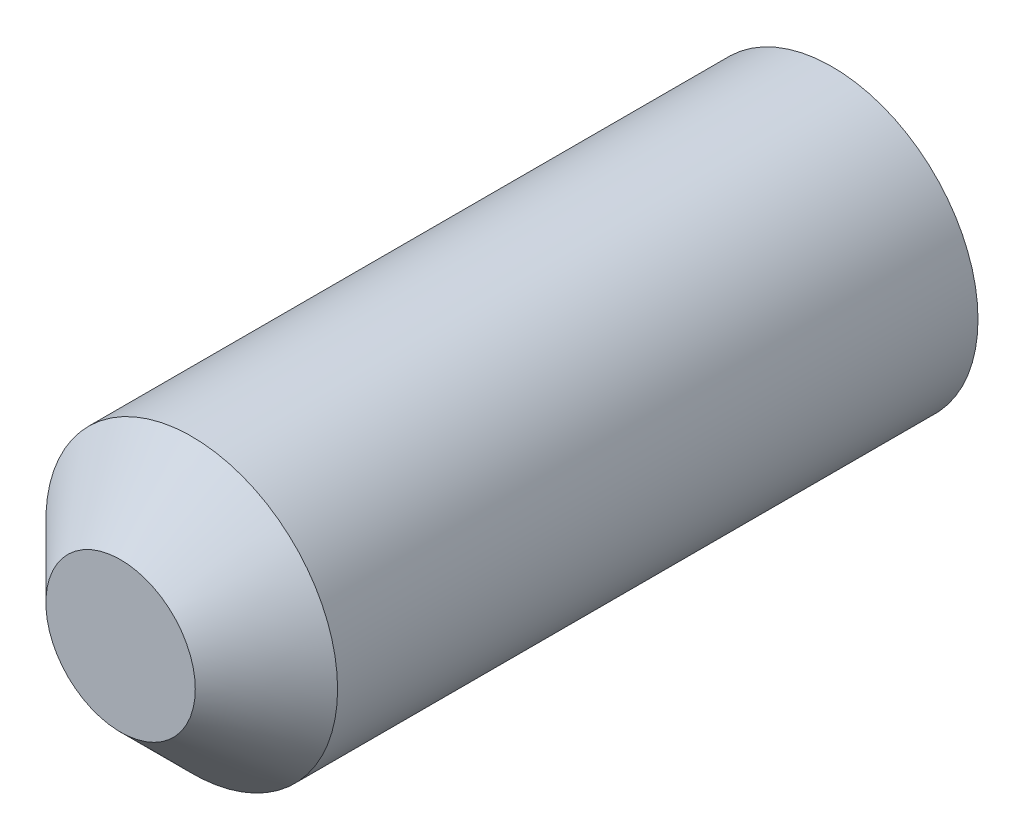
ISO-10303-21;
HEADER;
FILE_DESCRIPTION(('STEP AP214'),'2;1');
FILE_NAME('part.step','',(''),(''),'','','');
FILE_SCHEMA(('AUTOMOTIVE_DESIGN { 1 0 10303 214 1 1 1 1 }'));
ENDSEC;
DATA;
#1=APPLICATION_CONTEXT('core data for automotive mechanical design processes');
#2=APPLICATION_PROTOCOL_DEFINITION('international standard','automotive_design',2000,#1);
#3=PRODUCT_CONTEXT('',#1,'mechanical');
#4=PRODUCT('Part','Part','',(#3));
#5=PRODUCT_RELATED_PRODUCT_CATEGORY('part','',(#4));
#6=PRODUCT_DEFINITION_FORMATION('','',#4);
#7=PRODUCT_DEFINITION_CONTEXT('part definition',#1,'design');
#8=PRODUCT_DEFINITION('design','',#6,#7);
#9=PRODUCT_DEFINITION_SHAPE('','',#8);
#10=(LENGTH_UNIT() NAMED_UNIT(*) SI_UNIT(.MILLI.,.METRE.));
#11=(NAMED_UNIT(*) PLANE_ANGLE_UNIT() SI_UNIT($,.RADIAN.));
#12=(NAMED_UNIT(*) SI_UNIT($,.STERADIAN.) SOLID_ANGLE_UNIT());
#13=UNCERTAINTY_MEASURE_WITH_UNIT(LENGTH_MEASURE(1.E-05),#10,'distance_accuracy_value','');
#14=(GEOMETRIC_REPRESENTATION_CONTEXT(3) GLOBAL_UNCERTAINTY_ASSIGNED_CONTEXT((#13)) GLOBAL_UNIT_ASSIGNED_CONTEXT((#10,
#11,#12)) REPRESENTATION_CONTEXT('',''));
#15=CARTESIAN_POINT('',(0.,0.,0.));
#16=DIRECTION('',(0.,0.,1.));
#17=DIRECTION('',(1.,0.,0.));
#18=AXIS2_PLACEMENT_3D('',#15,#16,#17);
#19=CARTESIAN_POINT('',(0.,0.,10.));
#20=DIRECTION('',(0.,0.,-1.));
#21=DIRECTION('',(-1.,0.,0.));
#22=AXIS2_PLACEMENT_3D('',#19,#20,#21);
#23=CYLINDRICAL_SURFACE('',#22,2.05);
#24=CARTESIAN_POINT('',(0.,0.,9.));
#25=DIRECTION('',(0.,0.,1.));
#26=DIRECTION('',(1.,0.,0.));
#27=AXIS2_PLACEMENT_3D('',#24,#25,#26);
#28=CIRCLE('',#27,2.05);
#29=CARTESIAN_POINT('',(2.05,0.,9.));
#30=VERTEX_POINT('',#29);
#31=EDGE_CURVE('E10',#30,#30,#28,.F.);
#32=ORIENTED_EDGE('',*,*,#31,.T.);
#33=EDGE_LOOP('',(#32));
#34=FACE_BOUND('',#33,.T.);
#35=CARTESIAN_POINT('',(0.,0.,0.));
#36=DIRECTION('',(0.,0.,1.));
#37=DIRECTION('',(1.,0.,0.));
#38=AXIS2_PLACEMENT_3D('',#35,#36,#37);
#39=CIRCLE('',#38,2.05);
#40=CARTESIAN_POINT('',(2.05,0.,0.));
#41=VERTEX_POINT('',#40);
#42=EDGE_CURVE('E49',#41,#41,#39,.T.);
#43=ORIENTED_EDGE('',*,*,#42,.T.);
#44=EDGE_LOOP('',(#43));
#45=FACE_BOUND('',#44,.T.);
#46=ADVANCED_FACE('F37',(#34,#45),#23,.T.);
#47=CARTESIAN_POINT('',(0.,0.,10.));
#48=DIRECTION('',(0.,0.,1.));
#49=DIRECTION('',(1.,0.,0.));
#50=AXIS2_PLACEMENT_3D('',#47,#48,#49);
#51=PLANE('',#50);
#52=CARTESIAN_POINT('',(0.,0.,10.));
#53=DIRECTION('',(0.,0.,1.));
#54=DIRECTION('',(1.,0.,0.));
#55=AXIS2_PLACEMENT_3D('',#52,#53,#54);
#56=CIRCLE('',#55,1.05);
#57=CARTESIAN_POINT('',(1.05,0.,10.));
#58=VERTEX_POINT('',#57);
#59=EDGE_CURVE('E45',#58,#58,#56,.T.);
#60=ORIENTED_EDGE('',*,*,#59,.T.);
#61=EDGE_LOOP('',(#60));
#62=FACE_BOUND('',#61,.T.);
#63=ADVANCED_FACE('F59',(#62),#51,.T.);
#64=CARTESIAN_POINT('',(0.,0.,0.));
#65=DIRECTION('',(0.,0.,1.));
#66=DIRECTION('',(1.,0.,0.));
#67=AXIS2_PLACEMENT_3D('',#64,#65,#66);
#68=PLANE('',#67);
#69=ORIENTED_EDGE('',*,*,#42,.F.);
#70=EDGE_LOOP('',(#69));
#71=FACE_BOUND('',#70,.T.);
#72=ADVANCED_FACE('F57',(#71),#68,.F.);
#73=CARTESIAN_POINT('',(0.,0.,10.));
#74=DIRECTION('',(0.,0.,-1.));
#75=DIRECTION('',(-1.,0.,0.));
#76=AXIS2_PLACEMENT_3D('',#73,#74,#75);
#77=CONICAL_SURFACE('',#76,1.05,0.785398163397447);
#78=ORIENTED_EDGE('',*,*,#31,.F.);
#79=EDGE_LOOP('',(#78));
#80=FACE_BOUND('',#79,.T.);
#81=ORIENTED_EDGE('',*,*,#59,.F.);
#82=EDGE_LOOP('',(#81));
#83=FACE_BOUND('',#82,.T.);
#84=ADVANCED_FACE('F40',(#80,#83),#77,.T.);
#85=CLOSED_SHELL('',(#46,#63,#72,#84));
#86=MANIFOLD_SOLID_BREP('B2',#85);
#87=ADVANCED_BREP_SHAPE_REPRESENTATION('',(#18,#86),#14);
#88=SHAPE_DEFINITION_REPRESENTATION(#9,#87);
ENDSEC;
END-ISO-10303-21;
